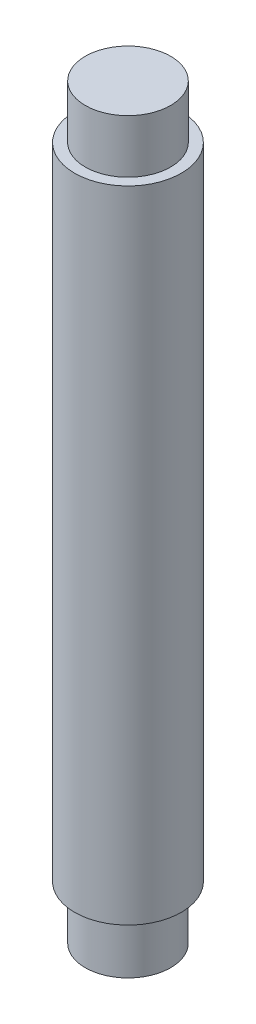
ISO-10303-21;
HEADER;
FILE_DESCRIPTION(('STEP AP214'),'2;1');
FILE_NAME('part.step','',(''),(''),'','','');
FILE_SCHEMA(('AUTOMOTIVE_DESIGN { 1 0 10303 214 1 1 1 1 }'));
ENDSEC;
DATA;
#1=APPLICATION_CONTEXT('core data for automotive mechanical design processes');
#2=APPLICATION_PROTOCOL_DEFINITION('international standard','automotive_design',2000,#1);
#3=PRODUCT_CONTEXT('',#1,'mechanical');
#4=PRODUCT('Part','Part','',(#3));
#5=PRODUCT_RELATED_PRODUCT_CATEGORY('part','',(#4));
#6=PRODUCT_DEFINITION_FORMATION('','',#4);
#7=PRODUCT_DEFINITION_CONTEXT('part definition',#1,'design');
#8=PRODUCT_DEFINITION('design','',#6,#7);
#9=PRODUCT_DEFINITION_SHAPE('','',#8);
#10=(LENGTH_UNIT() NAMED_UNIT(*) SI_UNIT(.MILLI.,.METRE.));
#11=(NAMED_UNIT(*) PLANE_ANGLE_UNIT() SI_UNIT($,.RADIAN.));
#12=(NAMED_UNIT(*) SI_UNIT($,.STERADIAN.) SOLID_ANGLE_UNIT());
#13=UNCERTAINTY_MEASURE_WITH_UNIT(LENGTH_MEASURE(1.E-05),#10,'distance_accuracy_value','');
#14=(GEOMETRIC_REPRESENTATION_CONTEXT(3) GLOBAL_UNCERTAINTY_ASSIGNED_CONTEXT((#13)) GLOBAL_UNIT_ASSIGNED_CONTEXT((#10,
#11,#12)) REPRESENTATION_CONTEXT('',''));
#15=CARTESIAN_POINT('',(0.,0.,0.));
#16=DIRECTION('',(0.,0.,1.));
#17=DIRECTION('',(1.,0.,0.));
#18=AXIS2_PLACEMENT_3D('',#15,#16,#17);
#19=CARTESIAN_POINT('',(0.,120.,0.));
#20=DIRECTION('',(0.,-1.,0.));
#21=DIRECTION('',(0.,0.,-1.));
#22=AXIS2_PLACEMENT_3D('',#19,#20,#21);
#23=CYLINDRICAL_SURFACE('',#22,10.);
#24=CARTESIAN_POINT('',(0.,120.,0.));
#25=DIRECTION('',(0.,1.,0.));
#26=DIRECTION('',(0.,0.,1.));
#27=AXIS2_PLACEMENT_3D('',#24,#25,#26);
#28=CIRCLE('',#27,10.);
#29=CARTESIAN_POINT('',(0.,120.,10.));
#30=VERTEX_POINT('',#29);
#31=EDGE_CURVE('E51',#30,#30,#28,.T.);
#32=ORIENTED_EDGE('',*,*,#31,.F.);
#33=EDGE_LOOP('',(#32));
#34=FACE_BOUND('',#33,.T.);
#35=CARTESIAN_POINT('',(0.,0.,0.));
#36=DIRECTION('',(0.,1.,0.));
#37=DIRECTION('',(0.,0.,1.));
#38=AXIS2_PLACEMENT_3D('',#35,#36,#37);
#39=CIRCLE('',#38,10.);
#40=CARTESIAN_POINT('',(0.,0.,10.));
#41=VERTEX_POINT('',#40);
#42=EDGE_CURVE('E42',#41,#41,#39,.T.);
#43=ORIENTED_EDGE('',*,*,#42,.T.);
#44=EDGE_LOOP('',(#43));
#45=FACE_BOUND('',#44,.T.);
#46=ADVANCED_FACE('F39',(#34,#45),#23,.T.);
#47=CARTESIAN_POINT('',(0.,120.,0.));
#48=DIRECTION('',(0.,1.,0.));
#49=DIRECTION('',(0.,0.,1.));
#50=AXIS2_PLACEMENT_3D('',#47,#48,#49);
#51=PLANE('',#50);
#52=CARTESIAN_POINT('',(0.,120.,0.));
#53=DIRECTION('',(0.,1.,0.));
#54=DIRECTION('',(0.,0.,1.));
#55=AXIS2_PLACEMENT_3D('',#52,#53,#54);
#56=CIRCLE('',#55,8.);
#57=CARTESIAN_POINT('',(0.,120.,8.));
#58=VERTEX_POINT('',#57);
#59=EDGE_CURVE('E10',#58,#58,#56,.T.);
#60=ORIENTED_EDGE('',*,*,#59,.F.);
#61=EDGE_LOOP('',(#60));
#62=FACE_BOUND('',#61,.T.);
#63=ORIENTED_EDGE('',*,*,#31,.T.);
#64=EDGE_LOOP('',(#63));
#65=FACE_BOUND('',#64,.T.);
#66=ADVANCED_FACE('F68',(#62,#65),#51,.T.);
#67=CARTESIAN_POINT('',(0.,0.,0.));
#68=DIRECTION('',(0.,1.,0.));
#69=DIRECTION('',(0.,0.,1.));
#70=AXIS2_PLACEMENT_3D('',#67,#68,#69);
#71=PLANE('',#70);
#72=CARTESIAN_POINT('',(0.,0.,0.));
#73=DIRECTION('',(0.,-1.,0.));
#74=DIRECTION('',(0.,0.,-1.));
#75=AXIS2_PLACEMENT_3D('',#72,#73,#74);
#76=CIRCLE('',#75,8.);
#77=CARTESIAN_POINT('',(0.,0.,-8.));
#78=VERTEX_POINT('',#77);
#79=EDGE_CURVE('E46',#78,#78,#76,.T.);
#80=ORIENTED_EDGE('',*,*,#79,.F.);
#81=EDGE_LOOP('',(#80));
#82=FACE_BOUND('',#81,.T.);
#83=ORIENTED_EDGE('',*,*,#42,.F.);
#84=EDGE_LOOP('',(#83));
#85=FACE_BOUND('',#84,.T.);
#86=ADVANCED_FACE('F65',(#82,#85),#71,.F.);
#87=CARTESIAN_POINT('',(0.,-10.,0.));
#88=DIRECTION('',(0.,1.,0.));
#89=DIRECTION('',(0.,0.,1.));
#90=AXIS2_PLACEMENT_3D('',#87,#88,#89);
#91=CYLINDRICAL_SURFACE('',#90,8.);
#92=CARTESIAN_POINT('',(0.,-10.,0.));
#93=DIRECTION('',(0.,-1.,0.));
#94=DIRECTION('',(0.,0.,-1.));
#95=AXIS2_PLACEMENT_3D('',#92,#93,#94);
#96=CIRCLE('',#95,8.);
#97=CARTESIAN_POINT('',(0.,-10.,-8.));
#98=VERTEX_POINT('',#97);
#99=EDGE_CURVE('E56',#98,#98,#96,.T.);
#100=ORIENTED_EDGE('',*,*,#99,.F.);
#101=EDGE_LOOP('',(#100));
#102=FACE_BOUND('',#101,.T.);
#103=ORIENTED_EDGE('',*,*,#79,.T.);
#104=EDGE_LOOP('',(#103));
#105=FACE_BOUND('',#104,.T.);
#106=ADVANCED_FACE('F67',(#102,#105),#91,.T.);
#107=CARTESIAN_POINT('',(0.,-10.,0.));
#108=DIRECTION('',(0.,-1.,0.));
#109=DIRECTION('',(0.,0.,-1.));
#110=AXIS2_PLACEMENT_3D('',#107,#108,#109);
#111=PLANE('',#110);
#112=ORIENTED_EDGE('',*,*,#99,.T.);
#113=EDGE_LOOP('',(#112));
#114=FACE_BOUND('',#113,.T.);
#115=ADVANCED_FACE('F74',(#114),#111,.T.);
#116=CARTESIAN_POINT('',(0.,130.,0.));
#117=DIRECTION('',(0.,-1.,0.));
#118=DIRECTION('',(0.,0.,-1.));
#119=AXIS2_PLACEMENT_3D('',#116,#117,#118);
#120=CYLINDRICAL_SURFACE('',#119,8.);
#121=CARTESIAN_POINT('',(0.,130.,0.));
#122=DIRECTION('',(0.,1.,0.));
#123=DIRECTION('',(0.,0.,1.));
#124=AXIS2_PLACEMENT_3D('',#121,#122,#123);
#125=CIRCLE('',#124,8.);
#126=CARTESIAN_POINT('',(0.,130.,8.));
#127=VERTEX_POINT('',#126);
#128=EDGE_CURVE('E55',#127,#127,#125,.T.);
#129=ORIENTED_EDGE('',*,*,#128,.F.);
#130=EDGE_LOOP('',(#129));
#131=FACE_BOUND('',#130,.T.);
#132=ORIENTED_EDGE('',*,*,#59,.T.);
#133=EDGE_LOOP('',(#132));
#134=FACE_BOUND('',#133,.T.);
#135=ADVANCED_FACE('F100',(#131,#134),#120,.T.);
#136=CARTESIAN_POINT('',(0.,130.,0.));
#137=DIRECTION('',(0.,1.,0.));
#138=DIRECTION('',(0.,0.,1.));
#139=AXIS2_PLACEMENT_3D('',#136,#137,#138);
#140=PLANE('',#139);
#141=ORIENTED_EDGE('',*,*,#128,.T.);
#142=EDGE_LOOP('',(#141));
#143=FACE_BOUND('',#142,.T.);
#144=ADVANCED_FACE('F105',(#143),#140,.T.);
#145=CLOSED_SHELL('',(#46,#66,#86,#106,#115,#135,#144));
#146=MANIFOLD_SOLID_BREP('B2',#145);
#147=ADVANCED_BREP_SHAPE_REPRESENTATION('',(#18,#146),#14);
#148=SHAPE_DEFINITION_REPRESENTATION(#9,#147);
ENDSEC;
END-ISO-10303-21;
